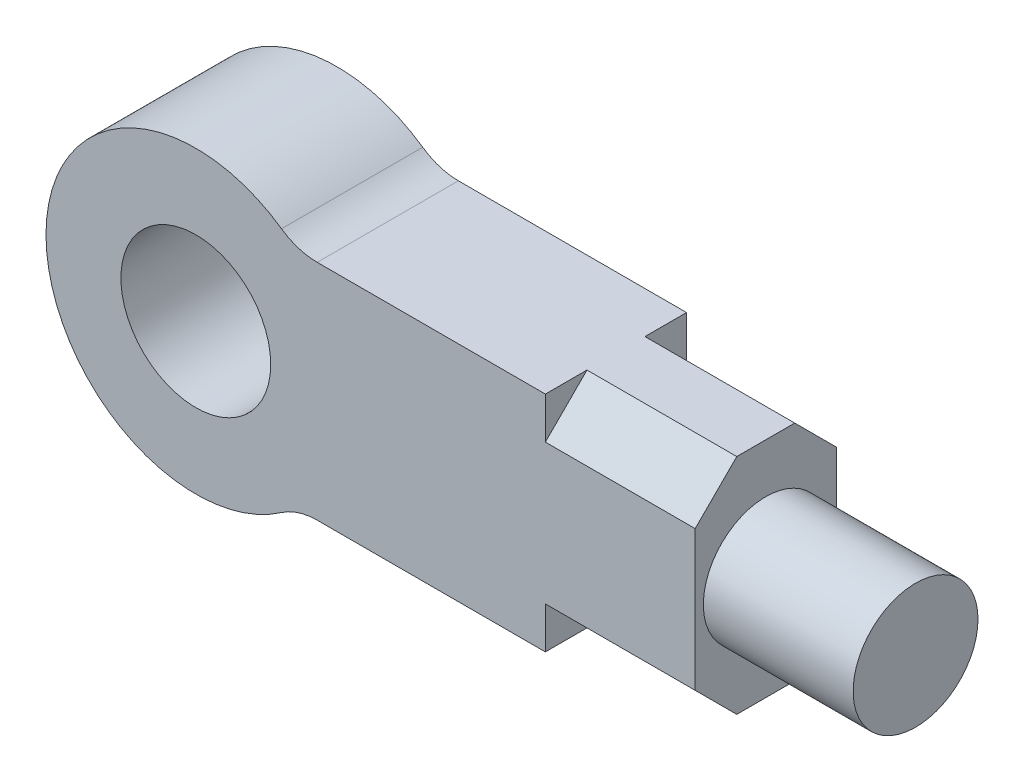
ISO-10303-21;
HEADER;
FILE_DESCRIPTION(('STEP AP214'),'2;1');
FILE_NAME('part.step','',(''),(''),'','','');
FILE_SCHEMA(('AUTOMOTIVE_DESIGN { 1 0 10303 214 1 1 1 1 }'));
ENDSEC;
DATA;
#1=APPLICATION_CONTEXT('core data for automotive mechanical design processes');
#2=APPLICATION_PROTOCOL_DEFINITION('international standard','automotive_design',2000,#1);
#3=PRODUCT_CONTEXT('',#1,'mechanical');
#4=PRODUCT('Part','Part','',(#3));
#5=PRODUCT_RELATED_PRODUCT_CATEGORY('part','',(#4));
#6=PRODUCT_DEFINITION_FORMATION('','',#4);
#7=PRODUCT_DEFINITION_CONTEXT('part definition',#1,'design');
#8=PRODUCT_DEFINITION('design','',#6,#7);
#9=PRODUCT_DEFINITION_SHAPE('','',#8);
#10=(LENGTH_UNIT() NAMED_UNIT(*) SI_UNIT(.MILLI.,.METRE.));
#11=(NAMED_UNIT(*) PLANE_ANGLE_UNIT() SI_UNIT($,.RADIAN.));
#12=(NAMED_UNIT(*) SI_UNIT($,.STERADIAN.) SOLID_ANGLE_UNIT());
#13=UNCERTAINTY_MEASURE_WITH_UNIT(LENGTH_MEASURE(1.E-05),#10,'distance_accuracy_value','');
#14=(GEOMETRIC_REPRESENTATION_CONTEXT(3) GLOBAL_UNCERTAINTY_ASSIGNED_CONTEXT((#13)) GLOBAL_UNIT_ASSIGNED_CONTEXT((#10,
#11,#12)) REPRESENTATION_CONTEXT('',''));
#15=CARTESIAN_POINT('',(0.,0.,0.));
#16=DIRECTION('',(0.,0.,1.));
#17=DIRECTION('',(1.,0.,0.));
#18=AXIS2_PLACEMENT_3D('',#15,#16,#17);
#19=CARTESIAN_POINT('',(28.,8.94427190999916,5.655));
#20=DIRECTION('',(-1.,0.,0.));
#21=DIRECTION('',(0.,0.,1.));
#22=AXIS2_PLACEMENT_3D('',#19,#20,#21);
#23=PLANE('',#22);
#24=DIRECTION('',(0.,-0.707106781186548,0.707106781186547));
#25=VECTOR('',#24,1.);
#26=CARTESIAN_POINT('',(28.,5.63296928833291,5.63296928833291));
#27=LINE('',#26,#25);
#28=CARTESIAN_POINT('',(28.,8.94427190999916,2.32166666666667));
#29=VERTEX_POINT('',#28);
#30=CARTESIAN_POINT('',(28.,5.61093857666582,5.655));
#31=VERTEX_POINT('',#30);
#32=EDGE_CURVE('E164',#29,#31,#27,.T.);
#33=ORIENTED_EDGE('',*,*,#32,.F.);
#34=DIRECTION('',(0.,0.,-1.));
#35=VECTOR('',#34,1.);
#36=CARTESIAN_POINT('',(28.,8.94427190999916,5.655));
#37=LINE('',#36,#35);
#38=CARTESIAN_POINT('',(28.,8.94427190999916,5.655));
#39=VERTEX_POINT('',#38);
#40=EDGE_CURVE('E41',#39,#29,#37,.T.);
#41=ORIENTED_EDGE('',*,*,#40,.F.);
#42=DIRECTION('',(0.,1.,0.));
#43=VECTOR('',#42,1.);
#44=CARTESIAN_POINT('',(28.,8.94427190999916,5.655));
#45=LINE('',#44,#43);
#46=EDGE_CURVE('E214',#31,#39,#45,.T.);
#47=ORIENTED_EDGE('',*,*,#46,.F.);
#48=EDGE_LOOP('',(#33,#41,#47));
#49=FACE_BOUND('',#48,.T.);
#50=ADVANCED_FACE('F37',(#49),#23,.F.);
#51=DIRECTION('',(0.,0.,-1.));
#52=VECTOR('',#51,1.);
#53=CARTESIAN_POINT('',(28.,-8.94427190999916,5.655));
#54=LINE('',#53,#52);
#55=CARTESIAN_POINT('',(28.,-8.94427190999916,5.655));
#56=VERTEX_POINT('',#55);
#57=CARTESIAN_POINT('',(28.,-8.94427190999916,2.32166666666667));
#58=VERTEX_POINT('',#57);
#59=EDGE_CURVE('E61',#56,#58,#54,.T.);
#60=ORIENTED_EDGE('',*,*,#59,.T.);
#61=DIRECTION('',(0.,0.707106781186548,0.707106781186547));
#62=VECTOR('',#61,1.);
#63=CARTESIAN_POINT('',(28.,-5.63296928833291,5.63296928833291));
#64=LINE('',#63,#62);
#65=CARTESIAN_POINT('',(28.,-5.61093857666582,5.655));
#66=VERTEX_POINT('',#65);
#67=EDGE_CURVE('E146',#58,#66,#64,.T.);
#68=ORIENTED_EDGE('',*,*,#67,.T.);
#69=EDGE_CURVE('E210',#56,#66,#45,.T.);
#70=ORIENTED_EDGE('',*,*,#69,.F.);
#71=EDGE_LOOP('',(#60,#68,#70));
#72=FACE_BOUND('',#71,.T.);
#73=ADVANCED_FACE('F288',(#72),#23,.F.);
#74=DIRECTION('',(0.,0.707106781186548,-0.707106781186547));
#75=VECTOR('',#74,1.);
#76=CARTESIAN_POINT('',(28.,-5.63296928833291,-5.63296928833291));
#77=LINE('',#76,#75);
#78=CARTESIAN_POINT('',(28.,-8.94427190999916,-2.32166666666667));
#79=VERTEX_POINT('',#78);
#80=CARTESIAN_POINT('',(28.,-5.61093857666582,-5.655));
#81=VERTEX_POINT('',#80);
#82=EDGE_CURVE('E53',#79,#81,#77,.T.);
#83=ORIENTED_EDGE('',*,*,#82,.F.);
#84=CARTESIAN_POINT('',(28.,-8.94427190999916,-5.655));
#85=VERTEX_POINT('',#84);
#86=EDGE_CURVE('E224',#79,#85,#54,.T.);
#87=ORIENTED_EDGE('',*,*,#86,.T.);
#88=DIRECTION('',(0.,1.,0.));
#89=VECTOR('',#88,1.);
#90=CARTESIAN_POINT('',(28.,8.94427190999916,-5.655));
#91=LINE('',#90,#89);
#92=EDGE_CURVE('E225',#85,#81,#91,.T.);
#93=ORIENTED_EDGE('',*,*,#92,.T.);
#94=EDGE_LOOP('',(#83,#87,#93));
#95=FACE_BOUND('',#94,.T.);
#96=ADVANCED_FACE('F292',(#95),#23,.F.);
#97=CARTESIAN_POINT('',(9.72405681287437,-13.9442719099992,5.655));
#98=DIRECTION('',(0.,0.,1.));
#99=DIRECTION('',(1.,0.,0.));
#100=AXIS2_PLACEMENT_3D('',#97,#98,#99);
#101=PLANE('',#100);
#102=ORIENTED_EDGE('',*,*,#69,.T.);
#103=DIRECTION('',(-1.,0.,0.));
#104=VECTOR('',#103,1.);
#105=CARTESIAN_POINT('',(40.,-5.61093857666582,5.655));
#106=LINE('',#105,#104);
#107=CARTESIAN_POINT('',(40.,-5.61093857666582,5.655));
#108=VERTEX_POINT('',#107);
#109=EDGE_CURVE('E182',#108,#66,#106,.T.);
#110=ORIENTED_EDGE('',*,*,#109,.F.);
#111=DIRECTION('',(0.,-1.,0.));
#112=VECTOR('',#111,1.);
#113=CARTESIAN_POINT('',(40.,0.,5.655));
#114=LINE('',#113,#112);
#115=CARTESIAN_POINT('',(40.,5.61093857666582,5.655));
#116=VERTEX_POINT('',#115);
#117=EDGE_CURVE('E162',#116,#108,#114,.T.);
#118=ORIENTED_EDGE('',*,*,#117,.F.);
#119=DIRECTION('',(-1.,0.,0.));
#120=VECTOR('',#119,1.);
#121=CARTESIAN_POINT('',(40.,5.61093857666582,5.655));
#122=LINE('',#121,#120);
#123=EDGE_CURVE('E188',#116,#31,#122,.T.);
#124=ORIENTED_EDGE('',*,*,#123,.T.);
#125=ORIENTED_EDGE('',*,*,#46,.T.);
#126=DIRECTION('',(-1.,0.,0.));
#127=VECTOR('',#126,1.);
#128=CARTESIAN_POINT('',(9.72405681287437,8.94427190999916,5.655));
#129=LINE('',#128,#127);
#130=CARTESIAN_POINT('',(9.72405681287437,8.94427190999916,5.655));
#131=VERTEX_POINT('',#130);
#132=EDGE_CURVE('E213',#39,#131,#129,.T.);
#133=ORIENTED_EDGE('',*,*,#132,.T.);
#134=CARTESIAN_POINT('',(9.72405681287437,13.9442719099992,5.655));
#135=DIRECTION('',(0.,0.,-1.));
#136=DIRECTION('',(-1.,0.,0.));
#137=AXIS2_PLACEMENT_3D('',#134,#135,#136);
#138=CIRCLE('',#137,5.);
#139=CARTESIAN_POINT('',(6.86404010320544,9.84301546588176,5.655));
#140=VERTEX_POINT('',#139);
#141=EDGE_CURVE('E216',#131,#140,#138,.T.);
#142=ORIENTED_EDGE('',*,*,#141,.T.);
#143=CARTESIAN_POINT('',(0.,0.,5.655));
#144=DIRECTION('',(0.,0.,1.));
#145=DIRECTION('',(1.,0.,0.));
#146=AXIS2_PLACEMENT_3D('',#143,#144,#145);
#147=CIRCLE('',#146,12.);
#148=CARTESIAN_POINT('',(6.86404010320543,-9.84301546588176,5.655));
#149=VERTEX_POINT('',#148);
#150=EDGE_CURVE('E218',#140,#149,#147,.T.);
#151=ORIENTED_EDGE('',*,*,#150,.T.);
#152=CARTESIAN_POINT('',(9.72405681287437,-13.9442719099992,5.655));
#153=DIRECTION('',(0.,0.,-1.));
#154=DIRECTION('',(1.,0.,0.));
#155=AXIS2_PLACEMENT_3D('',#152,#153,#154);
#156=CIRCLE('',#155,5.);
#157=CARTESIAN_POINT('',(9.72405681287437,-8.94427190999916,5.655));
#158=VERTEX_POINT('',#157);
#159=EDGE_CURVE('E220',#149,#158,#156,.T.);
#160=ORIENTED_EDGE('',*,*,#159,.T.);
#161=DIRECTION('',(1.,0.,0.));
#162=VECTOR('',#161,1.);
#163=CARTESIAN_POINT('',(9.72405681287437,-8.94427190999916,5.655));
#164=LINE('',#163,#162);
#165=EDGE_CURVE('E222',#158,#56,#164,.T.);
#166=ORIENTED_EDGE('',*,*,#165,.T.);
#167=EDGE_LOOP('',(#102,#110,#118,#124,#125,#133,#142,#151,#160,#166));
#168=FACE_BOUND('',#167,.T.);
#169=CARTESIAN_POINT('',(0.,0.,5.655));
#170=DIRECTION('',(0.,0.,1.));
#171=DIRECTION('',(1.,0.,0.));
#172=AXIS2_PLACEMENT_3D('',#169,#170,#171);
#173=CIRCLE('',#172,6.);
#174=CARTESIAN_POINT('',(6.,0.,5.655));
#175=VERTEX_POINT('',#174);
#176=EDGE_CURVE('E204',#175,#175,#173,.T.);
#177=ORIENTED_EDGE('',*,*,#176,.F.);
#178=EDGE_LOOP('',(#177));
#179=FACE_BOUND('',#178,.T.);
#180=ADVANCED_FACE('F284',(#168,#179),#101,.T.);
#181=CARTESIAN_POINT('',(9.72405681287437,-13.9442719099992,-5.655));
#182=DIRECTION('',(0.,0.,1.));
#183=DIRECTION('',(1.,0.,0.));
#184=AXIS2_PLACEMENT_3D('',#181,#182,#183);
#185=PLANE('',#184);
#186=ORIENTED_EDGE('',*,*,#92,.F.);
#187=DIRECTION('',(1.,0.,0.));
#188=VECTOR('',#187,1.);
#189=CARTESIAN_POINT('',(9.72405681287437,-8.94427190999916,-5.655));
#190=LINE('',#189,#188);
#191=CARTESIAN_POINT('',(9.72405681287437,-8.94427190999916,-5.655));
#192=VERTEX_POINT('',#191);
#193=EDGE_CURVE('E235',#192,#85,#190,.T.);
#194=ORIENTED_EDGE('',*,*,#193,.F.);
#195=CARTESIAN_POINT('',(9.72405681287437,-13.9442719099992,-5.655));
#196=DIRECTION('',(0.,0.,-1.));
#197=DIRECTION('',(1.,0.,0.));
#198=AXIS2_PLACEMENT_3D('',#195,#196,#197);
#199=CIRCLE('',#198,5.);
#200=CARTESIAN_POINT('',(6.86404010320543,-9.84301546588176,-5.655));
#201=VERTEX_POINT('',#200);
#202=EDGE_CURVE('E233',#201,#192,#199,.T.);
#203=ORIENTED_EDGE('',*,*,#202,.F.);
#204=CARTESIAN_POINT('',(0.,0.,-5.655));
#205=DIRECTION('',(0.,0.,1.));
#206=DIRECTION('',(1.,0.,0.));
#207=AXIS2_PLACEMENT_3D('',#204,#205,#206);
#208=CIRCLE('',#207,12.);
#209=CARTESIAN_POINT('',(6.86404010320544,9.84301546588176,-5.655));
#210=VERTEX_POINT('',#209);
#211=EDGE_CURVE('E231',#210,#201,#208,.T.);
#212=ORIENTED_EDGE('',*,*,#211,.F.);
#213=CARTESIAN_POINT('',(9.72405681287437,13.9442719099992,-5.655));
#214=DIRECTION('',(0.,0.,-1.));
#215=DIRECTION('',(-1.,0.,0.));
#216=AXIS2_PLACEMENT_3D('',#213,#214,#215);
#217=CIRCLE('',#216,5.);
#218=CARTESIAN_POINT('',(9.72405681287437,8.94427190999916,-5.655));
#219=VERTEX_POINT('',#218);
#220=EDGE_CURVE('E229',#219,#210,#217,.T.);
#221=ORIENTED_EDGE('',*,*,#220,.F.);
#222=DIRECTION('',(-1.,0.,0.));
#223=VECTOR('',#222,1.);
#224=CARTESIAN_POINT('',(9.72405681287437,8.94427190999916,-5.655));
#225=LINE('',#224,#223);
#226=CARTESIAN_POINT('',(28.,8.94427190999916,-5.655));
#227=VERTEX_POINT('',#226);
#228=EDGE_CURVE('E227',#227,#219,#225,.T.);
#229=ORIENTED_EDGE('',*,*,#228,.F.);
#230=CARTESIAN_POINT('',(28.,5.61093857666582,-5.655));
#231=VERTEX_POINT('',#230);
#232=EDGE_CURVE('E207',#231,#227,#91,.T.);
#233=ORIENTED_EDGE('',*,*,#232,.F.);
#234=DIRECTION('',(-1.,0.,0.));
#235=VECTOR('',#234,1.);
#236=CARTESIAN_POINT('',(40.,5.61093857666582,-5.655));
#237=LINE('',#236,#235);
#238=CARTESIAN_POINT('',(40.,5.61093857666582,-5.655));
#239=VERTEX_POINT('',#238);
#240=EDGE_CURVE('E197',#239,#231,#237,.T.);
#241=ORIENTED_EDGE('',*,*,#240,.F.);
#242=DIRECTION('',(0.,1.,0.));
#243=VECTOR('',#242,1.);
#244=CARTESIAN_POINT('',(40.,0.,-5.655));
#245=LINE('',#244,#243);
#246=CARTESIAN_POINT('',(40.,-5.61093857666582,-5.655));
#247=VERTEX_POINT('',#246);
#248=EDGE_CURVE('E172',#247,#239,#245,.T.);
#249=ORIENTED_EDGE('',*,*,#248,.F.);
#250=DIRECTION('',(-1.,0.,0.));
#251=VECTOR('',#250,1.);
#252=CARTESIAN_POINT('',(40.,-5.61093857666582,-5.655));
#253=LINE('',#252,#251);
#254=EDGE_CURVE('E200',#247,#81,#253,.T.);
#255=ORIENTED_EDGE('',*,*,#254,.T.);
#256=EDGE_LOOP('',(#186,#194,#203,#212,#221,#229,#233,#241,#249,#255));
#257=FACE_BOUND('',#256,.T.);
#258=CARTESIAN_POINT('',(0.,0.,-5.655));
#259=DIRECTION('',(0.,0.,1.));
#260=DIRECTION('',(1.,0.,0.));
#261=AXIS2_PLACEMENT_3D('',#258,#259,#260);
#262=CIRCLE('',#261,6.);
#263=CARTESIAN_POINT('',(6.,0.,-5.655));
#264=VERTEX_POINT('',#263);
#265=EDGE_CURVE('E148',#264,#264,#262,.T.);
#266=ORIENTED_EDGE('',*,*,#265,.T.);
#267=EDGE_LOOP('',(#266));
#268=FACE_BOUND('',#267,.T.);
#269=ADVANCED_FACE('F276',(#257,#268),#185,.F.);
#270=CARTESIAN_POINT('',(28.,8.94427190999916,-2.32166666666667));
#271=VERTEX_POINT('',#270);
#272=EDGE_CURVE('E248',#271,#227,#37,.T.);
#273=ORIENTED_EDGE('',*,*,#272,.F.);
#274=DIRECTION('',(0.,-0.707106781186548,-0.707106781186547));
#275=VECTOR('',#274,1.);
#276=CARTESIAN_POINT('',(28.,5.63296928833291,-5.63296928833291));
#277=LINE('',#276,#275);
#278=EDGE_CURVE('E167',#271,#231,#277,.T.);
#279=ORIENTED_EDGE('',*,*,#278,.T.);
#280=ORIENTED_EDGE('',*,*,#232,.T.);
#281=EDGE_LOOP('',(#273,#279,#280));
#282=FACE_BOUND('',#281,.T.);
#283=ADVANCED_FACE('F39',(#282),#23,.F.);
#284=CARTESIAN_POINT('',(9.72405681287437,8.94427190999916,5.655));
#285=DIRECTION('',(0.,-1.,0.));
#286=DIRECTION('',(0.,0.,-1.));
#287=AXIS2_PLACEMENT_3D('',#284,#285,#286);
#288=PLANE('',#287);
#289=ORIENTED_EDGE('',*,*,#228,.T.);
#290=DIRECTION('',(0.,0.,-1.));
#291=VECTOR('',#290,1.);
#292=CARTESIAN_POINT('',(9.72405681287437,8.94427190999916,5.655));
#293=LINE('',#292,#291);
#294=EDGE_CURVE('E246',#131,#219,#293,.T.);
#295=ORIENTED_EDGE('',*,*,#294,.F.);
#296=ORIENTED_EDGE('',*,*,#132,.F.);
#297=ORIENTED_EDGE('',*,*,#40,.T.);
#298=DIRECTION('',(-1.,0.,0.));
#299=VECTOR('',#298,1.);
#300=CARTESIAN_POINT('',(40.,8.94427190999916,2.32166666666667));
#301=LINE('',#300,#299);
#302=CARTESIAN_POINT('',(40.,8.94427190999916,2.32166666666667));
#303=VERTEX_POINT('',#302);
#304=EDGE_CURVE('E191',#303,#29,#301,.T.);
#305=ORIENTED_EDGE('',*,*,#304,.F.);
#306=DIRECTION('',(0.,0.,1.));
#307=VECTOR('',#306,1.);
#308=CARTESIAN_POINT('',(40.,8.94427190999916,0.));
#309=LINE('',#308,#307);
#310=CARTESIAN_POINT('',(40.,8.94427190999916,-2.32166666666667));
#311=VERTEX_POINT('',#310);
#312=EDGE_CURVE('E177',#311,#303,#309,.T.);
#313=ORIENTED_EDGE('',*,*,#312,.F.);
#314=DIRECTION('',(-1.,0.,0.));
#315=VECTOR('',#314,1.);
#316=CARTESIAN_POINT('',(40.,8.94427190999916,-2.32166666666667));
#317=LINE('',#316,#315);
#318=EDGE_CURVE('E194',#311,#271,#317,.T.);
#319=ORIENTED_EDGE('',*,*,#318,.T.);
#320=ORIENTED_EDGE('',*,*,#272,.T.);
#321=EDGE_LOOP('',(#289,#295,#296,#297,#305,#313,#319,#320));
#322=FACE_BOUND('',#321,.T.);
#323=ADVANCED_FACE('F259',(#322),#288,.F.);
#324=CARTESIAN_POINT('',(9.72405681287437,13.9442719099992,5.655));
#325=DIRECTION('',(0.,0.,-1.));
#326=DIRECTION('',(-1.,0.,0.));
#327=AXIS2_PLACEMENT_3D('',#324,#325,#326);
#328=CYLINDRICAL_SURFACE('',#327,5.);
#329=ORIENTED_EDGE('',*,*,#220,.T.);
#330=DIRECTION('',(0.,0.,-1.));
#331=VECTOR('',#330,1.);
#332=CARTESIAN_POINT('',(6.86404010320544,9.84301546588176,5.655));
#333=LINE('',#332,#331);
#334=EDGE_CURVE('E244',#140,#210,#333,.T.);
#335=ORIENTED_EDGE('',*,*,#334,.F.);
#336=ORIENTED_EDGE('',*,*,#141,.F.);
#337=ORIENTED_EDGE('',*,*,#294,.T.);
#338=EDGE_LOOP('',(#329,#335,#336,#337));
#339=FACE_BOUND('',#338,.T.);
#340=ADVANCED_FACE('F281',(#339),#328,.F.);
#341=CARTESIAN_POINT('',(0.,0.,5.655));
#342=DIRECTION('',(0.,0.,-1.));
#343=DIRECTION('',(-1.,0.,0.));
#344=AXIS2_PLACEMENT_3D('',#341,#342,#343);
#345=CYLINDRICAL_SURFACE('',#344,12.);
#346=ORIENTED_EDGE('',*,*,#211,.T.);
#347=DIRECTION('',(0.,0.,-1.));
#348=VECTOR('',#347,1.);
#349=CARTESIAN_POINT('',(6.86404010320543,-9.84301546588176,5.655));
#350=LINE('',#349,#348);
#351=EDGE_CURVE('E241',#149,#201,#350,.T.);
#352=ORIENTED_EDGE('',*,*,#351,.F.);
#353=ORIENTED_EDGE('',*,*,#150,.F.);
#354=ORIENTED_EDGE('',*,*,#334,.T.);
#355=EDGE_LOOP('',(#346,#352,#353,#354));
#356=FACE_BOUND('',#355,.T.);
#357=ADVANCED_FACE('F315',(#356),#345,.T.);
#358=CARTESIAN_POINT('',(9.72405681287437,-13.9442719099992,5.655));
#359=DIRECTION('',(0.,0.,-1.));
#360=DIRECTION('',(-1.,0.,0.));
#361=AXIS2_PLACEMENT_3D('',#358,#359,#360);
#362=CYLINDRICAL_SURFACE('',#361,5.);
#363=ORIENTED_EDGE('',*,*,#202,.T.);
#364=DIRECTION('',(0.,0.,-1.));
#365=VECTOR('',#364,1.);
#366=CARTESIAN_POINT('',(9.72405681287437,-8.94427190999916,5.655));
#367=LINE('',#366,#365);
#368=EDGE_CURVE('E238',#158,#192,#367,.T.);
#369=ORIENTED_EDGE('',*,*,#368,.F.);
#370=ORIENTED_EDGE('',*,*,#159,.F.);
#371=ORIENTED_EDGE('',*,*,#351,.T.);
#372=EDGE_LOOP('',(#363,#369,#370,#371));
#373=FACE_BOUND('',#372,.T.);
#374=ADVANCED_FACE('F312',(#373),#362,.F.);
#375=CARTESIAN_POINT('',(9.72405681287437,-8.94427190999916,5.655));
#376=DIRECTION('',(0.,1.,0.));
#377=DIRECTION('',(0.,0.,1.));
#378=AXIS2_PLACEMENT_3D('',#375,#376,#377);
#379=PLANE('',#378);
#380=ORIENTED_EDGE('',*,*,#193,.T.);
#381=ORIENTED_EDGE('',*,*,#86,.F.);
#382=DIRECTION('',(-1.,0.,0.));
#383=VECTOR('',#382,1.);
#384=CARTESIAN_POINT('',(40.,-8.94427190999916,-2.32166666666667));
#385=LINE('',#384,#383);
#386=CARTESIAN_POINT('',(40.,-8.94427190999916,-2.32166666666667));
#387=VERTEX_POINT('',#386);
#388=EDGE_CURVE('E149',#387,#79,#385,.T.);
#389=ORIENTED_EDGE('',*,*,#388,.F.);
#390=DIRECTION('',(0.,0.,-1.));
#391=VECTOR('',#390,1.);
#392=CARTESIAN_POINT('',(40.,-8.94427190999916,0.));
#393=LINE('',#392,#391);
#394=CARTESIAN_POINT('',(40.,-8.94427190999916,2.32166666666667));
#395=VERTEX_POINT('',#394);
#396=EDGE_CURVE('E152',#395,#387,#393,.T.);
#397=ORIENTED_EDGE('',*,*,#396,.F.);
#398=DIRECTION('',(-1.,0.,0.));
#399=VECTOR('',#398,1.);
#400=CARTESIAN_POINT('',(40.,-8.94427190999916,2.32166666666667));
#401=LINE('',#400,#399);
#402=EDGE_CURVE('E140',#395,#58,#401,.T.);
#403=ORIENTED_EDGE('',*,*,#402,.T.);
#404=ORIENTED_EDGE('',*,*,#59,.F.);
#405=ORIENTED_EDGE('',*,*,#165,.F.);
#406=ORIENTED_EDGE('',*,*,#368,.T.);
#407=EDGE_LOOP('',(#380,#381,#389,#397,#403,#404,#405,#406));
#408=FACE_BOUND('',#407,.T.);
#409=ADVANCED_FACE('F154',(#408),#379,.F.);
#410=CARTESIAN_POINT('',(0.,0.,5.655));
#411=DIRECTION('',(0.,0.,-1.));
#412=DIRECTION('',(-1.,0.,0.));
#413=AXIS2_PLACEMENT_3D('',#410,#411,#412);
#414=CYLINDRICAL_SURFACE('',#413,6.);
#415=ORIENTED_EDGE('',*,*,#176,.T.);
#416=EDGE_LOOP('',(#415));
#417=FACE_BOUND('',#416,.T.);
#418=ORIENTED_EDGE('',*,*,#265,.F.);
#419=EDGE_LOOP('',(#418));
#420=FACE_BOUND('',#419,.T.);
#421=ADVANCED_FACE('F307',(#417,#420),#414,.F.);
#422=CARTESIAN_POINT('',(40.,-5.63296928833291,5.63296928833291));
#423=DIRECTION('',(0.,-0.707106781186547,0.707106781186548));
#424=DIRECTION('',(0.,-0.707106781186548,-0.707106781186547));
#425=AXIS2_PLACEMENT_3D('',#422,#423,#424);
#426=PLANE('',#425);
#427=ORIENTED_EDGE('',*,*,#67,.F.);
#428=ORIENTED_EDGE('',*,*,#402,.F.);
#429=DIRECTION('',(0.,0.707106781186548,0.707106781186547));
#430=VECTOR('',#429,1.);
#431=CARTESIAN_POINT('',(40.,-5.63296928833291,5.63296928833291));
#432=LINE('',#431,#430);
#433=EDGE_CURVE('E145',#395,#108,#432,.T.);
#434=ORIENTED_EDGE('',*,*,#433,.T.);
#435=ORIENTED_EDGE('',*,*,#109,.T.);
#436=EDGE_LOOP('',(#427,#428,#434,#435));
#437=FACE_BOUND('',#436,.T.);
#438=ADVANCED_FACE('F142',(#437),#426,.T.);
#439=CARTESIAN_POINT('',(40.,-5.63296928833291,-5.63296928833291));
#440=DIRECTION('',(0.,0.707106781186547,0.707106781186548));
#441=DIRECTION('',(0.,-0.707106781186548,0.707106781186547));
#442=AXIS2_PLACEMENT_3D('',#439,#440,#441);
#443=PLANE('',#442);
#444=ORIENTED_EDGE('',*,*,#82,.T.);
#445=ORIENTED_EDGE('',*,*,#254,.F.);
#446=DIRECTION('',(0.,0.707106781186548,-0.707106781186547));
#447=VECTOR('',#446,1.);
#448=CARTESIAN_POINT('',(40.,-5.63296928833291,-5.63296928833291));
#449=LINE('',#448,#447);
#450=EDGE_CURVE('E158',#387,#247,#449,.T.);
#451=ORIENTED_EDGE('',*,*,#450,.F.);
#452=ORIENTED_EDGE('',*,*,#388,.T.);
#453=EDGE_LOOP('',(#444,#445,#451,#452));
#454=FACE_BOUND('',#453,.T.);
#455=ADVANCED_FACE('F349',(#454),#443,.F.);
#456=CARTESIAN_POINT('',(40.,5.63296928833291,-5.63296928833291));
#457=DIRECTION('',(0.,0.707106781186547,-0.707106781186548));
#458=DIRECTION('',(0.,0.707106781186548,0.707106781186547));
#459=AXIS2_PLACEMENT_3D('',#456,#457,#458);
#460=PLANE('',#459);
#461=ORIENTED_EDGE('',*,*,#278,.F.);
#462=ORIENTED_EDGE('',*,*,#318,.F.);
#463=DIRECTION('',(0.,-0.707106781186548,-0.707106781186547));
#464=VECTOR('',#463,1.);
#465=CARTESIAN_POINT('',(40.,5.63296928833291,-5.63296928833291));
#466=LINE('',#465,#464);
#467=EDGE_CURVE('E174',#311,#239,#466,.T.);
#468=ORIENTED_EDGE('',*,*,#467,.T.);
#469=ORIENTED_EDGE('',*,*,#240,.T.);
#470=EDGE_LOOP('',(#461,#462,#468,#469));
#471=FACE_BOUND('',#470,.T.);
#472=ADVANCED_FACE('F269',(#471),#460,.T.);
#473=CARTESIAN_POINT('',(40.,5.63296928833291,5.63296928833291));
#474=DIRECTION('',(0.,-0.707106781186547,-0.707106781186548));
#475=DIRECTION('',(0.,0.707106781186548,-0.707106781186547));
#476=AXIS2_PLACEMENT_3D('',#473,#474,#475);
#477=PLANE('',#476);
#478=ORIENTED_EDGE('',*,*,#32,.T.);
#479=ORIENTED_EDGE('',*,*,#123,.F.);
#480=DIRECTION('',(0.,-0.707106781186548,0.707106781186547));
#481=VECTOR('',#480,1.);
#482=CARTESIAN_POINT('',(40.,5.63296928833291,5.63296928833291));
#483=LINE('',#482,#481);
#484=EDGE_CURVE('E179',#303,#116,#483,.T.);
#485=ORIENTED_EDGE('',*,*,#484,.F.);
#486=ORIENTED_EDGE('',*,*,#304,.T.);
#487=EDGE_LOOP('',(#478,#479,#485,#486));
#488=FACE_BOUND('',#487,.T.);
#489=ADVANCED_FACE('F264',(#488),#477,.F.);
#490=CARTESIAN_POINT('',(40.,0.,0.));
#491=DIRECTION('',(1.,0.,0.));
#492=DIRECTION('',(0.,0.,-1.));
#493=AXIS2_PLACEMENT_3D('',#490,#491,#492);
#494=PLANE('',#493);
#495=CARTESIAN_POINT('',(40.,0.,0.));
#496=DIRECTION('',(1.,0.,0.));
#497=DIRECTION('',(0.,0.,-1.));
#498=AXIS2_PLACEMENT_3D('',#495,#496,#497);
#499=CIRCLE('',#498,5.);
#500=CARTESIAN_POINT('',(40.,0.,-5.));
#501=VERTEX_POINT('',#500);
#502=EDGE_CURVE('E11',#501,#501,#499,.T.);
#503=ORIENTED_EDGE('',*,*,#502,.F.);
#504=EDGE_LOOP('',(#503));
#505=FACE_BOUND('',#504,.T.);
#506=ORIENTED_EDGE('',*,*,#433,.F.);
#507=ORIENTED_EDGE('',*,*,#396,.T.);
#508=ORIENTED_EDGE('',*,*,#450,.T.);
#509=ORIENTED_EDGE('',*,*,#248,.T.);
#510=ORIENTED_EDGE('',*,*,#467,.F.);
#511=ORIENTED_EDGE('',*,*,#312,.T.);
#512=ORIENTED_EDGE('',*,*,#484,.T.);
#513=ORIENTED_EDGE('',*,*,#117,.T.);
#514=EDGE_LOOP('',(#506,#507,#508,#509,#510,#511,#512,#513));
#515=FACE_BOUND('',#514,.T.);
#516=ADVANCED_FACE('F160',(#505,#515),#494,.T.);
#517=CARTESIAN_POINT('',(52.,0.,0.));
#518=DIRECTION('',(-1.,0.,0.));
#519=DIRECTION('',(0.,0.,1.));
#520=AXIS2_PLACEMENT_3D('',#517,#518,#519);
#521=CYLINDRICAL_SURFACE('',#520,5.);
#522=CARTESIAN_POINT('',(52.,0.,0.));
#523=DIRECTION('',(1.,0.,0.));
#524=DIRECTION('',(0.,0.,-1.));
#525=AXIS2_PLACEMENT_3D('',#522,#523,#524);
#526=CIRCLE('',#525,5.);
#527=CARTESIAN_POINT('',(52.,0.,-5.));
#528=VERTEX_POINT('',#527);
#529=EDGE_CURVE('E184',#528,#528,#526,.T.);
#530=ORIENTED_EDGE('',*,*,#529,.F.);
#531=EDGE_LOOP('',(#530));
#532=FACE_BOUND('',#531,.T.);
#533=ORIENTED_EDGE('',*,*,#502,.T.);
#534=EDGE_LOOP('',(#533));
#535=FACE_BOUND('',#534,.T.);
#536=ADVANCED_FACE('F374',(#532,#535),#521,.T.);
#537=CARTESIAN_POINT('',(52.,0.,0.));
#538=DIRECTION('',(1.,0.,0.));
#539=DIRECTION('',(0.,0.,-1.));
#540=AXIS2_PLACEMENT_3D('',#537,#538,#539);
#541=PLANE('',#540);
#542=ORIENTED_EDGE('',*,*,#529,.T.);
#543=EDGE_LOOP('',(#542));
#544=FACE_BOUND('',#543,.T.);
#545=ADVANCED_FACE('F382',(#544),#541,.T.);
#546=CLOSED_SHELL('',(#50,#73,#96,#180,#269,#283,#323,#340,#357,#374,#409,#421,#438,#455,#472,
#489,#516,#536,#545));
#547=MANIFOLD_SOLID_BREP('B2',#546);
#548=ADVANCED_BREP_SHAPE_REPRESENTATION('',(#18,#547),#14);
#549=SHAPE_DEFINITION_REPRESENTATION(#9,#548);
ENDSEC;
END-ISO-10303-21;
